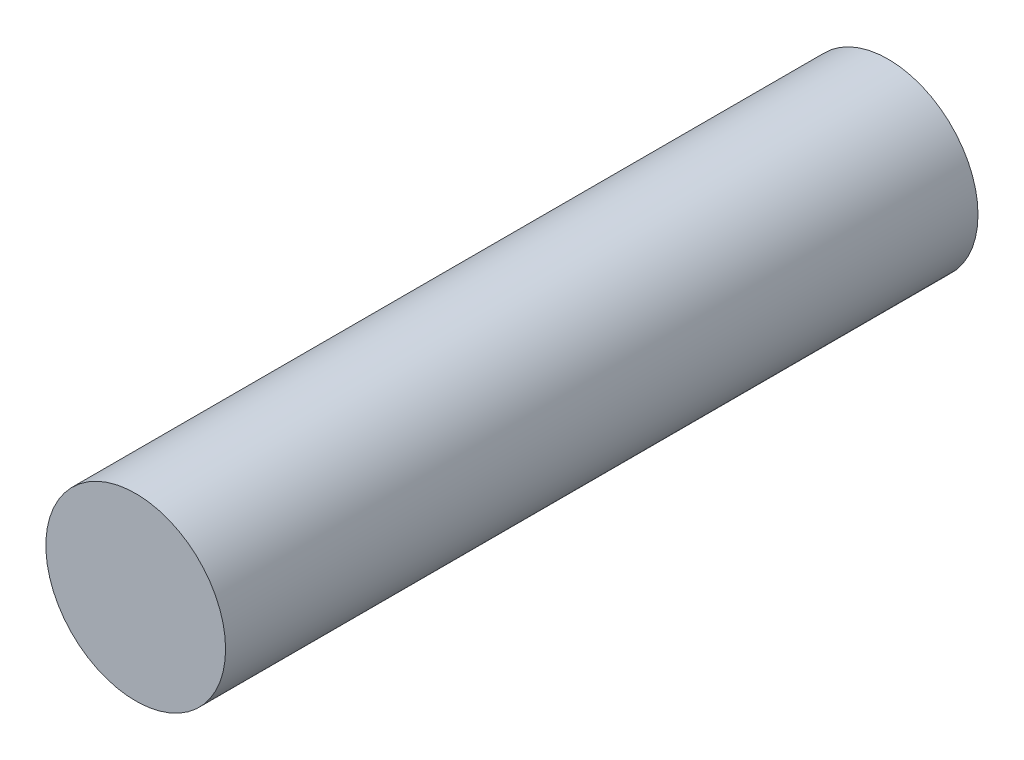
ISO-10303-21;
HEADER;
FILE_DESCRIPTION(('STEP AP214'),'2;1');
FILE_NAME('part.step','',(''),(''),'','','');
FILE_SCHEMA(('AUTOMOTIVE_DESIGN { 1 0 10303 214 1 1 1 1 }'));
ENDSEC;
DATA;
#1=APPLICATION_CONTEXT('core data for automotive mechanical design processes');
#2=APPLICATION_PROTOCOL_DEFINITION('international standard','automotive_design',2000,#1);
#3=PRODUCT_CONTEXT('',#1,'mechanical');
#4=PRODUCT('Part','Part','',(#3));
#5=PRODUCT_RELATED_PRODUCT_CATEGORY('part','',(#4));
#6=PRODUCT_DEFINITION_FORMATION('','',#4);
#7=PRODUCT_DEFINITION_CONTEXT('part definition',#1,'design');
#8=PRODUCT_DEFINITION('design','',#6,#7);
#9=PRODUCT_DEFINITION_SHAPE('','',#8);
#10=(LENGTH_UNIT() NAMED_UNIT(*) SI_UNIT(.MILLI.,.METRE.));
#11=(NAMED_UNIT(*) PLANE_ANGLE_UNIT() SI_UNIT($,.RADIAN.));
#12=(NAMED_UNIT(*) SI_UNIT($,.STERADIAN.) SOLID_ANGLE_UNIT());
#13=UNCERTAINTY_MEASURE_WITH_UNIT(LENGTH_MEASURE(1.E-05),#10,'distance_accuracy_value','');
#14=(GEOMETRIC_REPRESENTATION_CONTEXT(3) GLOBAL_UNCERTAINTY_ASSIGNED_CONTEXT((#13)) GLOBAL_UNIT_ASSIGNED_CONTEXT((#10,
#11,#12)) REPRESENTATION_CONTEXT('',''));
#15=CARTESIAN_POINT('',(0.,0.,0.));
#16=DIRECTION('',(0.,0.,1.));
#17=DIRECTION('',(1.,0.,0.));
#18=AXIS2_PLACEMENT_3D('',#15,#16,#17);
#19=CARTESIAN_POINT('',(0.,0.,18.));
#20=DIRECTION('',(0.,0.,-1.));
#21=DIRECTION('',(-1.,0.,0.));
#22=AXIS2_PLACEMENT_3D('',#19,#20,#21);
#23=CYLINDRICAL_SURFACE('',#22,2.15);
#24=CARTESIAN_POINT('',(0.,0.,18.));
#25=DIRECTION('',(0.,0.,1.));
#26=DIRECTION('',(1.,0.,0.));
#27=AXIS2_PLACEMENT_3D('',#24,#25,#26);
#28=CIRCLE('',#27,2.15);
#29=CARTESIAN_POINT('',(2.15,0.,18.));
#30=VERTEX_POINT('',#29);
#31=EDGE_CURVE('E10',#30,#30,#28,.T.);
#32=ORIENTED_EDGE('',*,*,#31,.F.);
#33=EDGE_LOOP('',(#32));
#34=FACE_BOUND('',#33,.T.);
#35=CARTESIAN_POINT('',(0.,0.,0.));
#36=DIRECTION('',(0.,0.,1.));
#37=DIRECTION('',(1.,0.,0.));
#38=AXIS2_PLACEMENT_3D('',#35,#36,#37);
#39=CIRCLE('',#38,2.15);
#40=CARTESIAN_POINT('',(2.15,0.,0.));
#41=VERTEX_POINT('',#40);
#42=EDGE_CURVE('E33',#41,#41,#39,.T.);
#43=ORIENTED_EDGE('',*,*,#42,.T.);
#44=EDGE_LOOP('',(#43));
#45=FACE_BOUND('',#44,.T.);
#46=ADVANCED_FACE('F30',(#34,#45),#23,.T.);
#47=CARTESIAN_POINT('',(0.,0.,18.));
#48=DIRECTION('',(0.,0.,1.));
#49=DIRECTION('',(1.,0.,0.));
#50=AXIS2_PLACEMENT_3D('',#47,#48,#49);
#51=PLANE('',#50);
#52=ORIENTED_EDGE('',*,*,#31,.T.);
#53=EDGE_LOOP('',(#52));
#54=FACE_BOUND('',#53,.T.);
#55=ADVANCED_FACE('F45',(#54),#51,.T.);
#56=CARTESIAN_POINT('',(0.,0.,0.));
#57=DIRECTION('',(0.,0.,1.));
#58=DIRECTION('',(1.,0.,0.));
#59=AXIS2_PLACEMENT_3D('',#56,#57,#58);
#60=PLANE('',#59);
#61=ORIENTED_EDGE('',*,*,#42,.F.);
#62=EDGE_LOOP('',(#61));
#63=FACE_BOUND('',#62,.T.);
#64=ADVANCED_FACE('F43',(#63),#60,.F.);
#65=CLOSED_SHELL('',(#46,#55,#64));
#66=MANIFOLD_SOLID_BREP('B2',#65);
#67=ADVANCED_BREP_SHAPE_REPRESENTATION('',(#18,#66),#14);
#68=SHAPE_DEFINITION_REPRESENTATION(#9,#67);
ENDSEC;
END-ISO-10303-21;
